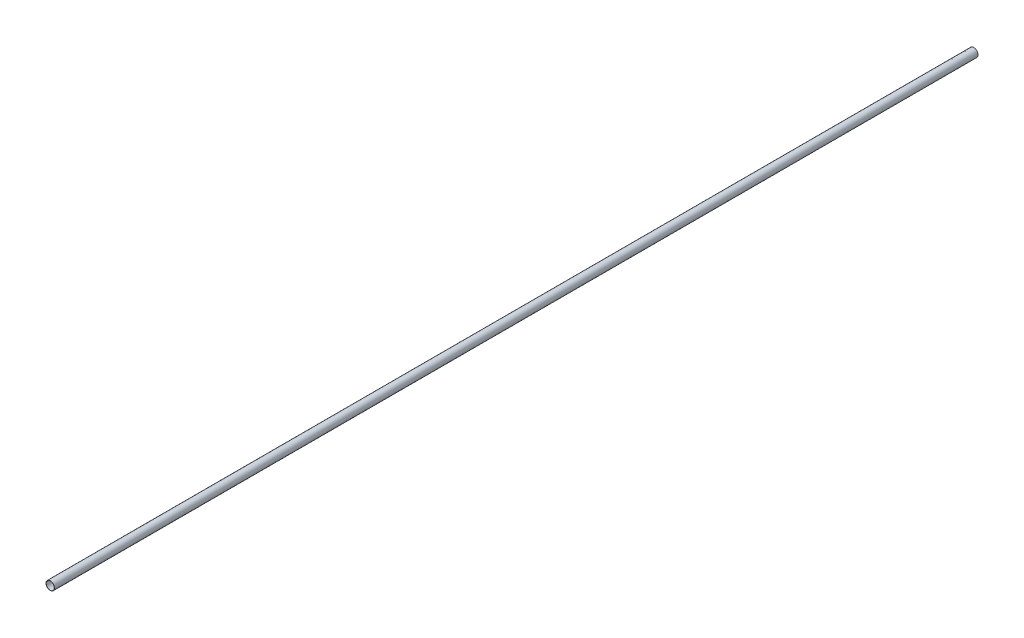
ISO-10303-21;
HEADER;
FILE_DESCRIPTION(('STEP AP214'),'2;1');
FILE_NAME('part.step','',(''),(''),'','','');
FILE_SCHEMA(('AUTOMOTIVE_DESIGN { 1 0 10303 214 1 1 1 1 }'));
ENDSEC;
DATA;
#1=APPLICATION_CONTEXT('core data for automotive mechanical design processes');
#2=APPLICATION_PROTOCOL_DEFINITION('international standard','automotive_design',2000,#1);
#3=PRODUCT_CONTEXT('',#1,'mechanical');
#4=PRODUCT('Part','Part','',(#3));
#5=PRODUCT_RELATED_PRODUCT_CATEGORY('part','',(#4));
#6=PRODUCT_DEFINITION_FORMATION('','',#4);
#7=PRODUCT_DEFINITION_CONTEXT('part definition',#1,'design');
#8=PRODUCT_DEFINITION('design','',#6,#7);
#9=PRODUCT_DEFINITION_SHAPE('','',#8);
#10=(LENGTH_UNIT() NAMED_UNIT(*) SI_UNIT(.MILLI.,.METRE.));
#11=(NAMED_UNIT(*) PLANE_ANGLE_UNIT() SI_UNIT($,.RADIAN.));
#12=(NAMED_UNIT(*) SI_UNIT($,.STERADIAN.) SOLID_ANGLE_UNIT());
#13=UNCERTAINTY_MEASURE_WITH_UNIT(LENGTH_MEASURE(1.E-05),#10,'distance_accuracy_value','');
#14=(GEOMETRIC_REPRESENTATION_CONTEXT(3) GLOBAL_UNCERTAINTY_ASSIGNED_CONTEXT((#13)) GLOBAL_UNIT_ASSIGNED_CONTEXT((#10,
#11,#12)) REPRESENTATION_CONTEXT('',''));
#15=CARTESIAN_POINT('',(0.,0.,0.));
#16=DIRECTION('',(0.,0.,1.));
#17=DIRECTION('',(1.,0.,0.));
#18=AXIS2_PLACEMENT_3D('',#15,#16,#17);
#19=CARTESIAN_POINT('',(0.140137906301864,0.,12000.));
#20=DIRECTION('',(0.,0.,-1.));
#21=DIRECTION('',(-1.,0.,0.));
#22=AXIS2_PLACEMENT_3D('',#19,#20,#21);
#23=CYLINDRICAL_SURFACE('',#22,52.7);
#24=CARTESIAN_POINT('',(0.140137906301864,0.,12000.));
#25=DIRECTION('',(0.,0.,1.));
#26=DIRECTION('',(1.,0.,0.));
#27=AXIS2_PLACEMENT_3D('',#24,#25,#26);
#28=CIRCLE('',#27,52.7);
#29=CARTESIAN_POINT('',(52.8401379063019,0.,12000.));
#30=VERTEX_POINT('',#29);
#31=EDGE_CURVE('E38',#30,#30,#28,.T.);
#32=ORIENTED_EDGE('',*,*,#31,.T.);
#33=EDGE_LOOP('',(#32));
#34=FACE_BOUND('',#33,.T.);
#35=CARTESIAN_POINT('',(0.140137906301864,0.,0.));
#36=DIRECTION('',(0.,0.,1.));
#37=DIRECTION('',(1.,0.,0.));
#38=AXIS2_PLACEMENT_3D('',#35,#36,#37);
#39=CIRCLE('',#38,52.7);
#40=CARTESIAN_POINT('',(52.8401379063019,0.,0.));
#41=VERTEX_POINT('',#40);
#42=EDGE_CURVE('E44',#41,#41,#39,.T.);
#43=ORIENTED_EDGE('',*,*,#42,.F.);
#44=EDGE_LOOP('',(#43));
#45=FACE_BOUND('',#44,.T.);
#46=ADVANCED_FACE('F31',(#34,#45),#23,.F.);
#47=CARTESIAN_POINT('',(0.140137906301864,0.,12000.));
#48=DIRECTION('',(0.,0.,-1.));
#49=DIRECTION('',(-1.,0.,0.));
#50=AXIS2_PLACEMENT_3D('',#47,#48,#49);
#51=CYLINDRICAL_SURFACE('',#50,55.);
#52=CARTESIAN_POINT('',(0.140137906301864,0.,12000.));
#53=DIRECTION('',(0.,0.,1.));
#54=DIRECTION('',(1.,0.,0.));
#55=AXIS2_PLACEMENT_3D('',#52,#53,#54);
#56=CIRCLE('',#55,55.);
#57=CARTESIAN_POINT('',(55.1401379063019,0.,12000.));
#58=VERTEX_POINT('',#57);
#59=EDGE_CURVE('E10',#58,#58,#56,.T.);
#60=ORIENTED_EDGE('',*,*,#59,.F.);
#61=EDGE_LOOP('',(#60));
#62=FACE_BOUND('',#61,.T.);
#63=CARTESIAN_POINT('',(0.140137906301864,0.,0.));
#64=DIRECTION('',(0.,0.,1.));
#65=DIRECTION('',(1.,0.,0.));
#66=AXIS2_PLACEMENT_3D('',#63,#64,#65);
#67=CIRCLE('',#66,55.);
#68=CARTESIAN_POINT('',(55.1401379063019,0.,0.));
#69=VERTEX_POINT('',#68);
#70=EDGE_CURVE('E34',#69,#69,#67,.T.);
#71=ORIENTED_EDGE('',*,*,#70,.T.);
#72=EDGE_LOOP('',(#71));
#73=FACE_BOUND('',#72,.T.);
#74=ADVANCED_FACE('F51',(#62,#73),#51,.T.);
#75=CARTESIAN_POINT('',(0.,0.,12000.));
#76=DIRECTION('',(0.,0.,1.));
#77=DIRECTION('',(1.,0.,0.));
#78=AXIS2_PLACEMENT_3D('',#75,#76,#77);
#79=PLANE('',#78);
#80=ORIENTED_EDGE('',*,*,#31,.F.);
#81=EDGE_LOOP('',(#80));
#82=FACE_BOUND('',#81,.T.);
#83=ORIENTED_EDGE('',*,*,#59,.T.);
#84=EDGE_LOOP('',(#83));
#85=FACE_BOUND('',#84,.T.);
#86=ADVANCED_FACE('F55',(#82,#85),#79,.T.);
#87=CARTESIAN_POINT('',(0.,0.,0.));
#88=DIRECTION('',(0.,0.,1.));
#89=DIRECTION('',(1.,0.,0.));
#90=AXIS2_PLACEMENT_3D('',#87,#88,#89);
#91=PLANE('',#90);
#92=ORIENTED_EDGE('',*,*,#42,.T.);
#93=EDGE_LOOP('',(#92));
#94=FACE_BOUND('',#93,.T.);
#95=ORIENTED_EDGE('',*,*,#70,.F.);
#96=EDGE_LOOP('',(#95));
#97=FACE_BOUND('',#96,.T.);
#98=ADVANCED_FACE('F53',(#94,#97),#91,.F.);
#99=CLOSED_SHELL('',(#46,#74,#86,#98));
#100=MANIFOLD_SOLID_BREP('B2',#99);
#101=ADVANCED_BREP_SHAPE_REPRESENTATION('',(#18,#100),#14);
#102=SHAPE_DEFINITION_REPRESENTATION(#9,#101);
ENDSEC;
END-ISO-10303-21;
